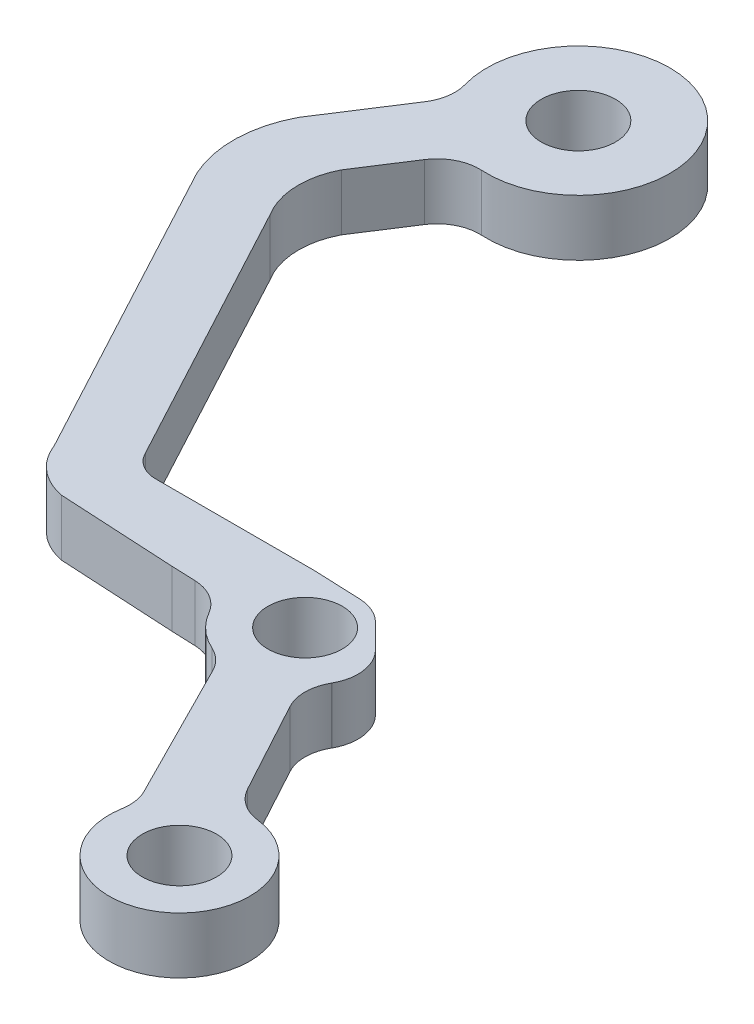
ISO-10303-21;
HEADER;
FILE_DESCRIPTION(('STEP AP214'),'2;1');
FILE_NAME('part.step','',(''),(''),'','','');
FILE_SCHEMA(('AUTOMOTIVE_DESIGN { 1 0 10303 214 1 1 1 1 }'));
ENDSEC;
DATA;
#1=APPLICATION_CONTEXT('core data for automotive mechanical design processes');
#2=APPLICATION_PROTOCOL_DEFINITION('international standard','automotive_design',2000,#1);
#3=PRODUCT_CONTEXT('',#1,'mechanical');
#4=PRODUCT('Part','Part','',(#3));
#5=PRODUCT_RELATED_PRODUCT_CATEGORY('part','',(#4));
#6=PRODUCT_DEFINITION_FORMATION('','',#4);
#7=PRODUCT_DEFINITION_CONTEXT('part definition',#1,'design');
#8=PRODUCT_DEFINITION('design','',#6,#7);
#9=PRODUCT_DEFINITION_SHAPE('','',#8);
#10=(LENGTH_UNIT() NAMED_UNIT(*) SI_UNIT(.MILLI.,.METRE.));
#11=(NAMED_UNIT(*) PLANE_ANGLE_UNIT() SI_UNIT($,.RADIAN.));
#12=(NAMED_UNIT(*) SI_UNIT($,.STERADIAN.) SOLID_ANGLE_UNIT());
#13=UNCERTAINTY_MEASURE_WITH_UNIT(LENGTH_MEASURE(1.E-05),#10,'distance_accuracy_value','');
#14=(GEOMETRIC_REPRESENTATION_CONTEXT(3) GLOBAL_UNCERTAINTY_ASSIGNED_CONTEXT((#13)) GLOBAL_UNIT_ASSIGNED_CONTEXT((#10,
#11,#12)) REPRESENTATION_CONTEXT('',''));
#15=CARTESIAN_POINT('',(0.,0.,0.));
#16=DIRECTION('',(0.,0.,1.));
#17=DIRECTION('',(1.,0.,0.));
#18=AXIS2_PLACEMENT_3D('',#15,#16,#17);
#19=CARTESIAN_POINT('',(83.0596199123193,0.,-55.4804717098662));
#20=DIRECTION('',(0.,1.,0.));
#21=DIRECTION('',(0.,0.,1.));
#22=AXIS2_PLACEMENT_3D('',#19,#20,#21);
#23=CYLINDRICAL_SURFACE('',#22,3.);
#24=CARTESIAN_POINT('',(83.0596199123193,4.,-55.4804717098662));
#25=DIRECTION('',(0.,-1.,0.));
#26=DIRECTION('',(0.,0.,-1.));
#27=AXIS2_PLACEMENT_3D('',#24,#25,#26);
#28=CIRCLE('',#27,3.);
#29=CARTESIAN_POINT('',(82.6980945632711,4.,-52.5023348053577));
#30=VERTEX_POINT('',#29);
#31=CARTESIAN_POINT('',(80.4223428568789,4.,-54.050517258547));
#32=VERTEX_POINT('',#31);
#33=EDGE_CURVE('E252',#30,#32,#28,.T.);
#34=ORIENTED_EDGE('',*,*,#33,.F.);
#35=DIRECTION('',(0.,1.,0.));
#36=VECTOR('',#35,1.);
#37=CARTESIAN_POINT('',(82.6980945632711,0.,-52.5023348053577));
#38=LINE('',#37,#36);
#39=CARTESIAN_POINT('',(82.6980945632711,0.,-52.5023348053577));
#40=VERTEX_POINT('',#39);
#41=EDGE_CURVE('E11',#40,#30,#38,.T.);
#42=ORIENTED_EDGE('',*,*,#41,.F.);
#43=CARTESIAN_POINT('',(83.0596199123193,0.,-55.4804717098662));
#44=DIRECTION('',(0.,-1.,0.));
#45=DIRECTION('',(0.,0.,-1.));
#46=AXIS2_PLACEMENT_3D('',#43,#44,#45);
#47=CIRCLE('',#46,3.);
#48=CARTESIAN_POINT('',(80.4223428568789,0.,-54.050517258547));
#49=VERTEX_POINT('',#48);
#50=EDGE_CURVE('E333',#40,#49,#47,.T.);
#51=ORIENTED_EDGE('',*,*,#50,.T.);
#52=DIRECTION('',(0.,1.,0.));
#53=VECTOR('',#52,1.);
#54=CARTESIAN_POINT('',(80.4223428568789,0.,-54.050517258547));
#55=LINE('',#54,#53);
#56=EDGE_CURVE('E38',#49,#32,#55,.T.);
#57=ORIENTED_EDGE('',*,*,#56,.T.);
#58=EDGE_LOOP('',(#34,#42,#51,#57));
#59=FACE_BOUND('',#58,.T.);
#60=ADVANCED_FACE('F35',(#59),#23,.F.);
#61=CARTESIAN_POINT('',(82.0955523148575,0.,-47.5387732978442));
#62=DIRECTION('',(0.,1.,0.));
#63=DIRECTION('',(0.,0.,1.));
#64=AXIS2_PLACEMENT_3D('',#61,#62,#63);
#65=CYLINDRICAL_SURFACE('',#64,4.99999999999926);
#66=CARTESIAN_POINT('',(82.0955523148575,4.,-47.5387732978442));
#67=DIRECTION('',(0.,1.,0.));
#68=DIRECTION('',(0.,0.,1.));
#69=AXIS2_PLACEMENT_3D('',#66,#67,#68);
#70=CIRCLE('',#69,4.99999999999926);
#71=CARTESIAN_POINT('',(77.1665825885927,4.,-48.3785693668741));
#72=VERTEX_POINT('',#71);
#73=EDGE_CURVE('E331',#72,#30,#70,.T.);
#74=ORIENTED_EDGE('',*,*,#73,.F.);
#75=DIRECTION('',(0.,1.,0.));
#76=VECTOR('',#75,1.);
#77=CARTESIAN_POINT('',(77.1665825885927,0.,-48.3785693668741));
#78=LINE('',#77,#76);
#79=CARTESIAN_POINT('',(77.1665825885927,0.,-48.3785693668741));
#80=VERTEX_POINT('',#79);
#81=EDGE_CURVE('E44',#80,#72,#78,.T.);
#82=ORIENTED_EDGE('',*,*,#81,.F.);
#83=CARTESIAN_POINT('',(82.0955523148575,0.,-47.5387732978442));
#84=DIRECTION('',(0.,1.,0.));
#85=DIRECTION('',(0.,0.,1.));
#86=AXIS2_PLACEMENT_3D('',#83,#84,#85);
#87=CIRCLE('',#86,4.99999999999926);
#88=EDGE_CURVE('E242',#80,#40,#87,.T.);
#89=ORIENTED_EDGE('',*,*,#88,.T.);
#90=ORIENTED_EDGE('',*,*,#41,.T.);
#91=EDGE_LOOP('',(#74,#82,#89,#90));
#92=FACE_BOUND('',#91,.T.);
#93=ADVANCED_FACE('F385',(#92),#65,.T.);
#94=CARTESIAN_POINT('',(74.2092007528334,0.,-48.8824470082921));
#95=DIRECTION('',(0.,1.,0.));
#96=DIRECTION('',(0.,0.,1.));
#97=AXIS2_PLACEMENT_3D('',#94,#95,#96);
#98=CYLINDRICAL_SURFACE('',#97,3.00000000000001);
#99=CARTESIAN_POINT('',(74.2092007528334,4.,-48.8824470082921));
#100=DIRECTION('',(0.,-1.,0.));
#101=DIRECTION('',(0.,0.,-1.));
#102=AXIS2_PLACEMENT_3D('',#99,#100,#101);
#103=CIRCLE('',#102,3.00000000000001);
#104=CARTESIAN_POINT('',(76.8865721846623,4.,-50.2358435562508));
#105=VERTEX_POINT('',#104);
#106=EDGE_CURVE('E229',#105,#72,#103,.T.);
#107=ORIENTED_EDGE('',*,*,#106,.F.);
#108=DIRECTION('',(0.,1.,0.));
#109=VECTOR('',#108,1.);
#110=CARTESIAN_POINT('',(76.8865721846623,0.,-50.2358435562508));
#111=LINE('',#110,#109);
#112=CARTESIAN_POINT('',(76.8865721846623,0.,-50.2358435562508));
#113=VERTEX_POINT('',#112);
#114=EDGE_CURVE('E224',#113,#105,#111,.T.);
#115=ORIENTED_EDGE('',*,*,#114,.F.);
#116=CARTESIAN_POINT('',(74.2092007528334,0.,-48.8824470082921));
#117=DIRECTION('',(0.,-1.,0.));
#118=DIRECTION('',(0.,0.,-1.));
#119=AXIS2_PLACEMENT_3D('',#116,#117,#118);
#120=CIRCLE('',#119,3.00000000000001);
#121=EDGE_CURVE('E227',#113,#80,#120,.T.);
#122=ORIENTED_EDGE('',*,*,#121,.T.);
#123=ORIENTED_EDGE('',*,*,#81,.T.);
#124=EDGE_LOOP('',(#107,#115,#122,#123));
#125=FACE_BOUND('',#124,.T.);
#126=ADVANCED_FACE('F226',(#125),#98,.F.);
#127=CARTESIAN_POINT('',(71.904734594805,0.,-60.0912179187853));
#128=DIRECTION('',(-0.892457143942962,0.,0.451132182652903));
#129=DIRECTION('',(0.451132182652903,0.,0.892457143942962));
#130=AXIS2_PLACEMENT_3D('',#127,#128,#129);
#131=PLANE('',#130);
#132=DIRECTION('',(0.451132182652903,0.,0.892457143942962));
#133=VECTOR('',#132,1.);
#134=CARTESIAN_POINT('',(71.904734594805,4.,-60.0912179187853));
#135=LINE('',#134,#133);
#136=CARTESIAN_POINT('',(71.904734594805,4.,-60.0912179187853));
#137=VERTEX_POINT('',#136);
#138=EDGE_CURVE('E328',#137,#105,#135,.T.);
#139=ORIENTED_EDGE('',*,*,#138,.F.);
#140=DIRECTION('',(0.,1.,0.));
#141=VECTOR('',#140,1.);
#142=CARTESIAN_POINT('',(71.904734594805,0.,-60.0912179187853));
#143=LINE('',#142,#141);
#144=CARTESIAN_POINT('',(71.904734594805,0.,-60.0912179187853));
#145=VERTEX_POINT('',#144);
#146=EDGE_CURVE('E234',#145,#137,#143,.T.);
#147=ORIENTED_EDGE('',*,*,#146,.F.);
#148=DIRECTION('',(0.451132182652903,0.,0.892457143942962));
#149=VECTOR('',#148,1.);
#150=CARTESIAN_POINT('',(71.904734594805,0.,-60.0912179187853));
#151=LINE('',#150,#149);
#152=EDGE_CURVE('E240',#145,#113,#151,.T.);
#153=ORIENTED_EDGE('',*,*,#152,.T.);
#154=ORIENTED_EDGE('',*,*,#114,.T.);
#155=EDGE_LOOP('',(#139,#147,#153,#154));
#156=FACE_BOUND('',#155,.T.);
#157=ADVANCED_FACE('F244',(#156),#131,.T.);
#158=CARTESIAN_POINT('',(69.2273631629761,0.,-58.7378213708266));
#159=DIRECTION('',(0.,1.,0.));
#160=DIRECTION('',(0.,0.,1.));
#161=AXIS2_PLACEMENT_3D('',#158,#159,#160);
#162=CYLINDRICAL_SURFACE('',#161,3.00000000000002);
#163=CARTESIAN_POINT('',(69.2273631629761,4.,-58.7378213708266));
#164=DIRECTION('',(0.,-1.,0.));
#165=DIRECTION('',(0.,0.,-1.));
#166=AXIS2_PLACEMENT_3D('',#163,#164,#165);
#167=CIRCLE('',#166,3.00000000000002);
#168=CARTESIAN_POINT('',(70.4690978001735,4.,-61.4687726869039));
#169=VERTEX_POINT('',#168);
#170=EDGE_CURVE('E325',#169,#137,#167,.T.);
#171=ORIENTED_EDGE('',*,*,#170,.F.);
#172=DIRECTION('',(0.,1.,0.));
#173=VECTOR('',#172,1.);
#174=CARTESIAN_POINT('',(70.4690978001735,0.,-61.4687726869039));
#175=LINE('',#174,#173);
#176=CARTESIAN_POINT('',(70.4690978001735,0.,-61.4687726869039));
#177=VERTEX_POINT('',#176);
#178=EDGE_CURVE('E337',#177,#169,#175,.T.);
#179=ORIENTED_EDGE('',*,*,#178,.F.);
#180=CARTESIAN_POINT('',(69.2273631629761,0.,-58.7378213708266));
#181=DIRECTION('',(0.,-1.,0.));
#182=DIRECTION('',(0.,0.,-1.));
#183=AXIS2_PLACEMENT_3D('',#180,#181,#182);
#184=CIRCLE('',#183,3.00000000000002);
#185=EDGE_CURVE('E245',#177,#145,#184,.T.);
#186=ORIENTED_EDGE('',*,*,#185,.T.);
#187=ORIENTED_EDGE('',*,*,#146,.T.);
#188=EDGE_LOOP('',(#171,#179,#186,#187));
#189=FACE_BOUND('',#188,.T.);
#190=ADVANCED_FACE('F398',(#189),#162,.F.);
#191=CARTESIAN_POINT('',(72.5386555288353,0.,-66.0203582136984));
#192=DIRECTION('',(0.,1.,0.));
#193=DIRECTION('',(0.,0.,1.));
#194=AXIS2_PLACEMENT_3D('',#191,#192,#193);
#195=CYLINDRICAL_SURFACE('',#194,4.99999999999894);
#196=CARTESIAN_POINT('',(72.5386555288353,4.,-66.0203582136984));
#197=DIRECTION('',(0.,1.,0.));
#198=DIRECTION('',(0.,0.,1.));
#199=AXIS2_PLACEMENT_3D('',#196,#197,#198);
#200=CIRCLE('',#199,4.99999999999894);
#201=CARTESIAN_POINT('',(68.2142097116327,4.,-63.5105438034147));
#202=VERTEX_POINT('',#201);
#203=EDGE_CURVE('E322',#202,#169,#200,.T.);
#204=ORIENTED_EDGE('',*,*,#203,.F.);
#205=DIRECTION('',(0.,1.,0.));
#206=VECTOR('',#205,1.);
#207=CARTESIAN_POINT('',(68.2142097116327,0.,-63.5105438034147));
#208=LINE('',#207,#206);
#209=CARTESIAN_POINT('',(68.2142097116327,0.,-63.5105438034147));
#210=VERTEX_POINT('',#209);
#211=EDGE_CURVE('E339',#210,#202,#208,.T.);
#212=ORIENTED_EDGE('',*,*,#211,.F.);
#213=CARTESIAN_POINT('',(72.5386555288353,0.,-66.0203582136984));
#214=DIRECTION('',(0.,1.,0.));
#215=DIRECTION('',(0.,0.,1.));
#216=AXIS2_PLACEMENT_3D('',#213,#214,#215);
#217=CIRCLE('',#216,4.99999999999894);
#218=EDGE_CURVE('E247',#210,#177,#217,.T.);
#219=ORIENTED_EDGE('',*,*,#218,.T.);
#220=ORIENTED_EDGE('',*,*,#178,.T.);
#221=EDGE_LOOP('',(#204,#212,#219,#220));
#222=FACE_BOUND('',#221,.T.);
#223=ADVANCED_FACE('F401',(#222),#195,.T.);
#224=CARTESIAN_POINT('',(65.6195422213106,0.,-62.0046551572441));
#225=DIRECTION('',(0.,1.,0.));
#226=DIRECTION('',(0.,0.,1.));
#227=AXIS2_PLACEMENT_3D('',#224,#225,#226);
#228=CYLINDRICAL_SURFACE('',#227,3.);
#229=CARTESIAN_POINT('',(65.6195422213106,4.,-62.0046551572441));
#230=DIRECTION('',(0.,-1.,0.));
#231=DIRECTION('',(0.,0.,-1.));
#232=AXIS2_PLACEMENT_3D('',#229,#230,#231);
#233=CIRCLE('',#232,3.);
#234=CARTESIAN_POINT('',(65.7370015210181,4.,-65.0023548274766));
#235=VERTEX_POINT('',#234);
#236=EDGE_CURVE('E319',#235,#202,#233,.T.);
#237=ORIENTED_EDGE('',*,*,#236,.F.);
#238=DIRECTION('',(0.,1.,0.));
#239=VECTOR('',#238,1.);
#240=CARTESIAN_POINT('',(65.7370015210181,0.,-65.0023548274766));
#241=LINE('',#240,#239);
#242=CARTESIAN_POINT('',(65.7370015210181,0.,-65.0023548274766));
#243=VERTEX_POINT('',#242);
#244=EDGE_CURVE('E341',#243,#235,#241,.T.);
#245=ORIENTED_EDGE('',*,*,#244,.F.);
#246=CARTESIAN_POINT('',(65.6195422213106,0.,-62.0046551572441));
#247=DIRECTION('',(0.,-1.,0.));
#248=DIRECTION('',(0.,0.,-1.));
#249=AXIS2_PLACEMENT_3D('',#246,#247,#248);
#250=CIRCLE('',#249,3.);
#251=EDGE_CURVE('E597',#243,#210,#250,.T.);
#252=ORIENTED_EDGE('',*,*,#251,.T.);
#253=ORIENTED_EDGE('',*,*,#211,.T.);
#254=EDGE_LOOP('',(#237,#245,#252,#253));
#255=FACE_BOUND('',#254,.T.);
#256=ADVANCED_FACE('F405',(#255),#228,.F.);
#257=CARTESIAN_POINT('',(64.0438520876017,0.,-65.0686977465904));
#258=DIRECTION('',(-0.0391530999025642,0.,0.999233223410841));
#259=DIRECTION('',(0.999233223410841,0.,0.0391530999025642));
#260=AXIS2_PLACEMENT_3D('',#257,#258,#259);
#261=PLANE('',#260);
#262=DIRECTION('',(0.999233223410841,0.,0.0391530999025642));
#263=VECTOR('',#262,1.);
#264=CARTESIAN_POINT('',(64.0438520876017,4.,-65.0686977465904));
#265=LINE('',#264,#263);
#266=CARTESIAN_POINT('',(64.0438520876017,4.,-65.0686977465904));
#267=VERTEX_POINT('',#266);
#268=EDGE_CURVE('E316',#267,#235,#265,.T.);
#269=ORIENTED_EDGE('',*,*,#268,.F.);
#270=DIRECTION('',(0.,1.,0.));
#271=VECTOR('',#270,1.);
#272=CARTESIAN_POINT('',(64.0438520876017,0.,-65.0686977465904));
#273=LINE('',#272,#271);
#274=CARTESIAN_POINT('',(64.0438520876017,0.,-65.0686977465904));
#275=VERTEX_POINT('',#274);
#276=EDGE_CURVE('E343',#275,#267,#273,.T.);
#277=ORIENTED_EDGE('',*,*,#276,.F.);
#278=DIRECTION('',(0.999233223410841,0.,0.0391530999025642));
#279=VECTOR('',#278,1.);
#280=CARTESIAN_POINT('',(64.0438520876017,0.,-65.0686977465904));
#281=LINE('',#280,#279);
#282=EDGE_CURVE('E594',#275,#243,#281,.T.);
#283=ORIENTED_EDGE('',*,*,#282,.T.);
#284=ORIENTED_EDGE('',*,*,#244,.T.);
#285=EDGE_LOOP('',(#269,#277,#283,#284));
#286=FACE_BOUND('',#285,.T.);
#287=ADVANCED_FACE('F409',(#286),#261,.T.);
#288=CARTESIAN_POINT('',(55.7375550039908,0.,-65.5195460971233));
#289=DIRECTION('',(-0.054198120998577,0.,0.998530201686571));
#290=DIRECTION('',(0.998530201686571,0.,0.054198120998577));
#291=AXIS2_PLACEMENT_3D('',#288,#289,#290);
#292=PLANE('',#291);
#293=DIRECTION('',(0.998530201686571,0.,0.054198120998577));
#294=VECTOR('',#293,1.);
#295=CARTESIAN_POINT('',(55.7375550039908,4.,-65.5195460971233));
#296=LINE('',#295,#294);
#297=CARTESIAN_POINT('',(55.7375550039908,4.,-65.5195460971233));
#298=VERTEX_POINT('',#297);
#299=EDGE_CURVE('E313',#298,#267,#296,.T.);
#300=ORIENTED_EDGE('',*,*,#299,.F.);
#301=DIRECTION('',(0.,1.,0.));
#302=VECTOR('',#301,1.);
#303=CARTESIAN_POINT('',(55.7375550039908,0.,-65.5195460971233));
#304=LINE('',#303,#302);
#305=CARTESIAN_POINT('',(55.7375550039908,0.,-65.5195460971233));
#306=VERTEX_POINT('',#305);
#307=EDGE_CURVE('E345',#306,#298,#304,.T.);
#308=ORIENTED_EDGE('',*,*,#307,.F.);
#309=DIRECTION('',(0.998530201686571,0.,0.054198120998577));
#310=VECTOR('',#309,1.);
#311=CARTESIAN_POINT('',(55.7375550039908,0.,-65.5195460971233));
#312=LINE('',#311,#310);
#313=EDGE_CURVE('E591',#306,#275,#312,.T.);
#314=ORIENTED_EDGE('',*,*,#313,.T.);
#315=ORIENTED_EDGE('',*,*,#276,.T.);
#316=EDGE_LOOP('',(#300,#308,#314,#315));
#317=FACE_BOUND('',#316,.T.);
#318=ADVANCED_FACE('F413',(#317),#292,.T.);
#319=CARTESIAN_POINT('',(56.5567534131058,0.,-69.8369992339137));
#320=DIRECTION('',(0.,1.,0.));
#321=DIRECTION('',(0.,0.,1.));
#322=AXIS2_PLACEMENT_3D('',#319,#320,#321);
#323=CYLINDRICAL_SURFACE('',#322,4.39448377194385);
#324=CARTESIAN_POINT('',(56.5567534131058,4.,-69.8369992339137));
#325=DIRECTION('',(0.,1.,0.));
#326=DIRECTION('',(0.,0.,1.));
#327=AXIS2_PLACEMENT_3D('',#324,#325,#326);
#328=CIRCLE('',#327,4.39448377194385);
#329=CARTESIAN_POINT('',(52.4487514228716,4.,-68.2762919358881));
#330=VERTEX_POINT('',#329);
#331=EDGE_CURVE('E310',#330,#298,#328,.T.);
#332=ORIENTED_EDGE('',*,*,#331,.F.);
#333=DIRECTION('',(0.,1.,0.));
#334=VECTOR('',#333,1.);
#335=CARTESIAN_POINT('',(52.4487514228716,0.,-68.2762919358881));
#336=LINE('',#335,#334);
#337=CARTESIAN_POINT('',(52.4487514228716,0.,-68.2762919358881));
#338=VERTEX_POINT('',#337);
#339=EDGE_CURVE('E347',#338,#330,#336,.T.);
#340=ORIENTED_EDGE('',*,*,#339,.F.);
#341=CARTESIAN_POINT('',(56.5567534131058,0.,-69.8369992339137));
#342=DIRECTION('',(0.,1.,0.));
#343=DIRECTION('',(0.,0.,1.));
#344=AXIS2_PLACEMENT_3D('',#341,#342,#343);
#345=CIRCLE('',#344,4.39448377194385);
#346=EDGE_CURVE('E588',#338,#306,#345,.T.);
#347=ORIENTED_EDGE('',*,*,#346,.T.);
#348=ORIENTED_EDGE('',*,*,#307,.T.);
#349=EDGE_LOOP('',(#332,#340,#347,#348));
#350=FACE_BOUND('',#349,.T.);
#351=ADVANCED_FACE('F417',(#350),#323,.T.);
#352=CARTESIAN_POINT('',(40.729811239487,0.,-90.1399863078729));
#353=DIRECTION('',(-0.881375126691502,0.,0.472417067906675));
#354=DIRECTION('',(0.472417067906675,0.,0.881375126691502));
#355=AXIS2_PLACEMENT_3D('',#352,#353,#354);
#356=PLANE('',#355);
#357=DIRECTION('',(0.472417067906675,0.,0.881375126691502));
#358=VECTOR('',#357,1.);
#359=CARTESIAN_POINT('',(40.729811239487,4.,-90.1399863078729));
#360=LINE('',#359,#358);
#361=CARTESIAN_POINT('',(40.729811239487,4.,-90.1399863078729));
#362=VERTEX_POINT('',#361);
#363=EDGE_CURVE('E307',#362,#330,#360,.T.);
#364=ORIENTED_EDGE('',*,*,#363,.F.);
#365=DIRECTION('',(0.,1.,0.));
#366=VECTOR('',#365,1.);
#367=CARTESIAN_POINT('',(40.729811239487,0.,-90.1399863078729));
#368=LINE('',#367,#366);
#369=CARTESIAN_POINT('',(40.729811239487,0.,-90.1399863078729));
#370=VERTEX_POINT('',#369);
#371=EDGE_CURVE('E349',#370,#362,#368,.T.);
#372=ORIENTED_EDGE('',*,*,#371,.F.);
#373=DIRECTION('',(0.472417067906675,0.,0.881375126691502));
#374=VECTOR('',#373,1.);
#375=CARTESIAN_POINT('',(40.729811239487,0.,-90.1399863078729));
#376=LINE('',#375,#374);
#377=EDGE_CURVE('E585',#370,#338,#376,.T.);
#378=ORIENTED_EDGE('',*,*,#377,.T.);
#379=ORIENTED_EDGE('',*,*,#339,.T.);
#380=EDGE_LOOP('',(#364,#372,#378,#379));
#381=FACE_BOUND('',#380,.T.);
#382=ADVANCED_FACE('F421',(#381),#356,.T.);
#383=CARTESIAN_POINT('',(47.9507836864078,0.,-93.4720928434898));
#384=DIRECTION('',(0.,1.,0.));
#385=DIRECTION('',(0.,0.,1.));
#386=AXIS2_PLACEMENT_3D('',#383,#384,#385);
#387=CYLINDRICAL_SURFACE('',#386,7.95269621222196);
#388=CARTESIAN_POINT('',(47.9507836864078,4.,-93.4720928434898));
#389=DIRECTION('',(0.,1.,0.));
#390=DIRECTION('',(0.,0.,1.));
#391=AXIS2_PLACEMENT_3D('',#388,#389,#390);
#392=CIRCLE('',#391,7.95269621222196);
#393=CARTESIAN_POINT('',(40.9176822364304,4.,-97.1843510562513));
#394=VERTEX_POINT('',#393);
#395=EDGE_CURVE('E304',#394,#362,#392,.T.);
#396=ORIENTED_EDGE('',*,*,#395,.F.);
#397=DIRECTION('',(0.,1.,0.));
#398=VECTOR('',#397,1.);
#399=CARTESIAN_POINT('',(40.9176822364304,0.,-97.1843510562513));
#400=LINE('',#399,#398);
#401=CARTESIAN_POINT('',(40.9176822364304,0.,-97.1843510562513));
#402=VERTEX_POINT('',#401);
#403=EDGE_CURVE('E351',#402,#394,#400,.T.);
#404=ORIENTED_EDGE('',*,*,#403,.F.);
#405=CARTESIAN_POINT('',(47.9507836864078,0.,-93.4720928434898));
#406=DIRECTION('',(0.,1.,0.));
#407=DIRECTION('',(0.,0.,1.));
#408=AXIS2_PLACEMENT_3D('',#405,#406,#407);
#409=CIRCLE('',#408,7.95269621222196);
#410=EDGE_CURVE('E582',#402,#370,#409,.T.);
#411=ORIENTED_EDGE('',*,*,#410,.T.);
#412=ORIENTED_EDGE('',*,*,#371,.T.);
#413=EDGE_LOOP('',(#396,#404,#411,#412));
#414=FACE_BOUND('',#413,.T.);
#415=ADVANCED_FACE('F425',(#414),#387,.T.);
#416=CARTESIAN_POINT('',(44.4477571247904,0.,-102.646677462451));
#417=DIRECTION('',(-0.839876598626589,0.,-0.542777393670215));
#418=DIRECTION('',(-0.542777393670215,0.,0.839876598626589));
#419=AXIS2_PLACEMENT_3D('',#416,#417,#418);
#420=PLANE('',#419);
#421=DIRECTION('',(-0.542777393670215,0.,0.839876598626589));
#422=VECTOR('',#421,1.);
#423=CARTESIAN_POINT('',(44.4477571247904,4.,-102.646677462451));
#424=LINE('',#423,#422);
#425=CARTESIAN_POINT('',(44.4477571247904,4.,-102.646677462451));
#426=VERTEX_POINT('',#425);
#427=EDGE_CURVE('E301',#426,#394,#424,.T.);
#428=ORIENTED_EDGE('',*,*,#427,.F.);
#429=DIRECTION('',(0.,1.,0.));
#430=VECTOR('',#429,1.);
#431=CARTESIAN_POINT('',(44.4477571247904,0.,-102.646677462451));
#432=LINE('',#431,#430);
#433=CARTESIAN_POINT('',(44.4477571247904,0.,-102.646677462451));
#434=VERTEX_POINT('',#433);
#435=EDGE_CURVE('E353',#434,#426,#432,.T.);
#436=ORIENTED_EDGE('',*,*,#435,.F.);
#437=DIRECTION('',(-0.542777393670215,0.,0.839876598626589));
#438=VECTOR('',#437,1.);
#439=CARTESIAN_POINT('',(44.4477571247904,0.,-102.646677462451));
#440=LINE('',#439,#438);
#441=EDGE_CURVE('E579',#434,#402,#440,.T.);
#442=ORIENTED_EDGE('',*,*,#441,.T.);
#443=ORIENTED_EDGE('',*,*,#403,.T.);
#444=EDGE_LOOP('',(#428,#436,#442,#443));
#445=FACE_BOUND('',#444,.T.);
#446=ADVANCED_FACE('F429',(#445),#420,.T.);
#447=CARTESIAN_POINT('',(41.9281273289106,0.,-104.275009643461));
#448=DIRECTION('',(0.,1.,0.));
#449=DIRECTION('',(0.,0.,1.));
#450=AXIS2_PLACEMENT_3D('',#447,#448,#449);
#451=CYLINDRICAL_SURFACE('',#450,3.);
#452=CARTESIAN_POINT('',(41.9281273289106,4.,-104.275009643461));
#453=DIRECTION('',(0.,-1.,0.));
#454=DIRECTION('',(0.,0.,-1.));
#455=AXIS2_PLACEMENT_3D('',#452,#453,#454);
#456=CIRCLE('',#455,3.);
#457=CARTESIAN_POINT('',(44.8098479908705,4.,-105.109087593316));
#458=VERTEX_POINT('',#457);
#459=EDGE_CURVE('E298',#458,#426,#456,.T.);
#460=ORIENTED_EDGE('',*,*,#459,.F.);
#461=DIRECTION('',(0.,1.,0.));
#462=VECTOR('',#461,1.);
#463=CARTESIAN_POINT('',(44.8098479908705,0.,-105.109087593316));
#464=LINE('',#463,#462);
#465=CARTESIAN_POINT('',(44.8098479908705,0.,-105.109087593316));
#466=VERTEX_POINT('',#465);
#467=EDGE_CURVE('E355',#466,#458,#464,.T.);
#468=ORIENTED_EDGE('',*,*,#467,.F.);
#469=CARTESIAN_POINT('',(41.9281273289106,0.,-104.275009643461));
#470=DIRECTION('',(0.,-1.,0.));
#471=DIRECTION('',(0.,0.,-1.));
#472=AXIS2_PLACEMENT_3D('',#469,#470,#471);
#473=CIRCLE('',#472,3.);
#474=EDGE_CURVE('E576',#466,#434,#473,.T.);
#475=ORIENTED_EDGE('',*,*,#474,.T.);
#476=ORIENTED_EDGE('',*,*,#435,.T.);
#477=EDGE_LOOP('',(#460,#468,#475,#476));
#478=FACE_BOUND('',#477,.T.);
#479=ADVANCED_FACE('F433',(#478),#451,.F.);
#480=CARTESIAN_POINT('',(51.0535760917837,0.,-106.916256484667));
#481=DIRECTION('',(0.,1.,0.));
#482=DIRECTION('',(0.,0.,1.));
#483=AXIS2_PLACEMENT_3D('',#480,#481,#482);
#484=CYLINDRICAL_SURFACE('',#483,6.50000000000002);
#485=CARTESIAN_POINT('',(51.0535760917837,4.,-106.916256484667));
#486=DIRECTION('',(0.,1.,0.));
#487=DIRECTION('',(0.,0.,1.));
#488=AXIS2_PLACEMENT_3D('',#485,#486,#487);
#489=CIRCLE('',#488,6.50000000000002);
#490=CARTESIAN_POINT('',(50.6775616564036,4.,-100.427141510775));
#491=VERTEX_POINT('',#490);
#492=EDGE_CURVE('E295',#491,#458,#489,.T.);
#493=ORIENTED_EDGE('',*,*,#492,.F.);
#494=DIRECTION('',(0.,1.,0.));
#495=VECTOR('',#494,1.);
#496=CARTESIAN_POINT('',(50.6775616564036,0.,-100.427141510775));
#497=LINE('',#496,#495);
#498=CARTESIAN_POINT('',(50.6775616564036,0.,-100.427141510775));
#499=VERTEX_POINT('',#498);
#500=EDGE_CURVE('E357',#499,#491,#497,.T.);
#501=ORIENTED_EDGE('',*,*,#500,.F.);
#502=CARTESIAN_POINT('',(51.0535760917837,0.,-106.916256484667));
#503=DIRECTION('',(0.,1.,0.));
#504=DIRECTION('',(0.,0.,1.));
#505=AXIS2_PLACEMENT_3D('',#502,#503,#504);
#506=CIRCLE('',#505,6.50000000000002);
#507=EDGE_CURVE('E573',#499,#466,#506,.T.);
#508=ORIENTED_EDGE('',*,*,#507,.T.);
#509=ORIENTED_EDGE('',*,*,#467,.T.);
#510=EDGE_LOOP('',(#493,#501,#508,#509));
#511=FACE_BOUND('',#510,.T.);
#512=ADVANCED_FACE('F437',(#511),#484,.T.);
#513=CARTESIAN_POINT('',(50.504016532382,0.,-97.4321653689791));
#514=DIRECTION('',(0.,1.,0.));
#515=DIRECTION('',(0.,0.,1.));
#516=AXIS2_PLACEMENT_3D('',#513,#514,#515);
#517=CYLINDRICAL_SURFACE('',#516,3.);
#518=CARTESIAN_POINT('',(50.504016532382,4.,-97.4321653689791));
#519=DIRECTION('',(0.,-1.,0.));
#520=DIRECTION('',(0.,0.,-1.));
#521=AXIS2_PLACEMENT_3D('',#518,#519,#520);
#522=CIRCLE('',#521,3.);
#523=CARTESIAN_POINT('',(47.9843867365023,4.,-99.0604975499897));
#524=VERTEX_POINT('',#523);
#525=EDGE_CURVE('E292',#524,#491,#522,.T.);
#526=ORIENTED_EDGE('',*,*,#525,.F.);
#527=DIRECTION('',(0.,1.,0.));
#528=VECTOR('',#527,1.);
#529=CARTESIAN_POINT('',(47.9843867365023,0.,-99.0604975499897));
#530=LINE('',#529,#528);
#531=CARTESIAN_POINT('',(47.9843867365023,0.,-99.0604975499897));
#532=VERTEX_POINT('',#531);
#533=EDGE_CURVE('E359',#532,#524,#530,.T.);
#534=ORIENTED_EDGE('',*,*,#533,.F.);
#535=CARTESIAN_POINT('',(50.504016532382,0.,-97.4321653689791));
#536=DIRECTION('',(0.,-1.,0.));
#537=DIRECTION('',(0.,0.,-1.));
#538=AXIS2_PLACEMENT_3D('',#535,#536,#537);
#539=CIRCLE('',#538,3.);
#540=EDGE_CURVE('E570',#532,#499,#539,.T.);
#541=ORIENTED_EDGE('',*,*,#540,.T.);
#542=ORIENTED_EDGE('',*,*,#500,.T.);
#543=EDGE_LOOP('',(#526,#534,#541,#542));
#544=FACE_BOUND('',#543,.T.);
#545=ADVANCED_FACE('F441',(#544),#517,.F.);
#546=CARTESIAN_POINT('',(45.6619983025613,0.,-95.4669070258914));
#547=DIRECTION('',(0.839876598626591,0.,0.542777393670212));
#548=DIRECTION('',(0.542777393670212,0.,-0.839876598626591));
#549=AXIS2_PLACEMENT_3D('',#546,#547,#548);
#550=PLANE('',#549);
#551=DIRECTION('',(0.542777393670212,0.,-0.839876598626591));
#552=VECTOR('',#551,1.);
#553=CARTESIAN_POINT('',(45.6619983025613,4.,-95.4669070258914));
#554=LINE('',#553,#552);
#555=CARTESIAN_POINT('',(45.6619983025613,4.,-95.4669070258914));
#556=VERTEX_POINT('',#555);
#557=EDGE_CURVE('E289',#556,#524,#554,.T.);
#558=ORIENTED_EDGE('',*,*,#557,.F.);
#559=DIRECTION('',(0.,1.,0.));
#560=VECTOR('',#559,1.);
#561=CARTESIAN_POINT('',(45.6619983025613,0.,-95.4669070258914));
#562=LINE('',#561,#560);
#563=CARTESIAN_POINT('',(45.6619983025613,0.,-95.4669070258914));
#564=VERTEX_POINT('',#563);
#565=EDGE_CURVE('E361',#564,#556,#562,.T.);
#566=ORIENTED_EDGE('',*,*,#565,.F.);
#567=DIRECTION('',(0.542777393670212,0.,-0.839876598626591));
#568=VECTOR('',#567,1.);
#569=CARTESIAN_POINT('',(45.6619983025613,0.,-95.4669070258914));
#570=LINE('',#569,#568);
#571=EDGE_CURVE('E567',#564,#532,#570,.T.);
#572=ORIENTED_EDGE('',*,*,#571,.T.);
#573=ORIENTED_EDGE('',*,*,#533,.T.);
#574=EDGE_LOOP('',(#558,#566,#572,#573));
#575=FACE_BOUND('',#574,.T.);
#576=ADVANCED_FACE('F445',(#575),#550,.T.);
#577=CARTESIAN_POINT('',(50.4346230187118,0.,-93.0228199018659));
#578=DIRECTION('',(0.,1.,0.));
#579=DIRECTION('',(0.,0.,1.));
#580=AXIS2_PLACEMENT_3D('',#577,#578,#579);
#581=CYLINDRICAL_SURFACE('',#580,5.36204331864607);
#582=CARTESIAN_POINT('',(50.4346230187118,4.,-93.0228199018659));
#583=DIRECTION('',(0.,-1.,0.));
#584=DIRECTION('',(0.,0.,-1.));
#585=AXIS2_PLACEMENT_3D('',#582,#583,#584);
#586=CIRCLE('',#585,5.36204331864607);
#587=CARTESIAN_POINT('',(45.9134750427678,4.,-90.1399863078728));
#588=VERTEX_POINT('',#587);
#589=EDGE_CURVE('E286',#588,#556,#586,.T.);
#590=ORIENTED_EDGE('',*,*,#589,.F.);
#591=DIRECTION('',(0.,1.,0.));
#592=VECTOR('',#591,1.);
#593=CARTESIAN_POINT('',(45.9134750427678,0.,-90.1399863078728));
#594=LINE('',#593,#592);
#595=CARTESIAN_POINT('',(45.9134750427678,0.,-90.1399863078728));
#596=VERTEX_POINT('',#595);
#597=EDGE_CURVE('E363',#596,#588,#594,.T.);
#598=ORIENTED_EDGE('',*,*,#597,.F.);
#599=CARTESIAN_POINT('',(50.4346230187118,0.,-93.0228199018659));
#600=DIRECTION('',(0.,-1.,0.));
#601=DIRECTION('',(0.,0.,-1.));
#602=AXIS2_PLACEMENT_3D('',#599,#600,#601);
#603=CIRCLE('',#602,5.36204331864607);
#604=EDGE_CURVE('E564',#596,#564,#603,.T.);
#605=ORIENTED_EDGE('',*,*,#604,.T.);
#606=ORIENTED_EDGE('',*,*,#565,.T.);
#607=EDGE_LOOP('',(#590,#598,#605,#606));
#608=FACE_BOUND('',#607,.T.);
#609=ADVANCED_FACE('F449',(#608),#581,.F.);
#610=CARTESIAN_POINT('',(56.1159876547183,0.,-71.1054478527404));
#611=DIRECTION('',(0.881375126691525,0.,-0.472417067906631));
#612=DIRECTION('',(-0.472417067906631,0.,-0.881375126691525));
#613=AXIS2_PLACEMENT_3D('',#610,#611,#612);
#614=PLANE('',#613);
#615=DIRECTION('',(-0.472417067906631,0.,-0.881375126691525));
#616=VECTOR('',#615,1.);
#617=CARTESIAN_POINT('',(56.1159876547183,4.,-71.1054478527404));
#618=LINE('',#617,#616);
#619=CARTESIAN_POINT('',(56.1159876547183,4.,-71.1054478527404));
#620=VERTEX_POINT('',#619);
#621=EDGE_CURVE('E283',#620,#588,#618,.T.);
#622=ORIENTED_EDGE('',*,*,#621,.F.);
#623=DIRECTION('',(0.,1.,0.));
#624=VECTOR('',#623,1.);
#625=CARTESIAN_POINT('',(56.1159876547183,0.,-71.1054478527404));
#626=LINE('',#625,#624);
#627=CARTESIAN_POINT('',(56.1159876547183,0.,-71.1054478527404));
#628=VERTEX_POINT('',#627);
#629=EDGE_CURVE('E365',#628,#620,#626,.T.);
#630=ORIENTED_EDGE('',*,*,#629,.F.);
#631=DIRECTION('',(-0.472417067906631,0.,-0.881375126691525));
#632=VECTOR('',#631,1.);
#633=CARTESIAN_POINT('',(56.1159876547183,0.,-71.1054478527404));
#634=LINE('',#633,#632);
#635=EDGE_CURVE('E561',#628,#596,#634,.T.);
#636=ORIENTED_EDGE('',*,*,#635,.T.);
#637=ORIENTED_EDGE('',*,*,#597,.T.);
#638=EDGE_LOOP('',(#622,#630,#636,#637));
#639=FACE_BOUND('',#638,.T.);
#640=ADVANCED_FACE('F453',(#639),#614,.T.);
#641=CARTESIAN_POINT('',(58.0835273072173,0.,-72.0445419678826));
#642=DIRECTION('',(0.,1.,0.));
#643=DIRECTION('',(0.,0.,1.));
#644=AXIS2_PLACEMENT_3D('',#641,#642,#643);
#645=CYLINDRICAL_SURFACE('',#644,2.18016284741548);
#646=CARTESIAN_POINT('',(58.0835273072173,4.,-72.0445419678826));
#647=DIRECTION('',(0.,-1.,0.));
#648=DIRECTION('',(0.,0.,-1.));
#649=AXIS2_PLACEMENT_3D('',#646,#647,#648);
#650=CIRCLE('',#649,2.18016284741548);
#651=CARTESIAN_POINT('',(58.0479318695405,4.,-69.864669722528));
#652=VERTEX_POINT('',#651);
#653=EDGE_CURVE('E280',#652,#620,#650,.T.);
#654=ORIENTED_EDGE('',*,*,#653,.F.);
#655=DIRECTION('',(0.,1.,0.));
#656=VECTOR('',#655,1.);
#657=CARTESIAN_POINT('',(58.0479318695405,0.,-69.864669722528));
#658=LINE('',#657,#656);
#659=CARTESIAN_POINT('',(58.0479318695405,0.,-69.864669722528));
#660=VERTEX_POINT('',#659);
#661=EDGE_CURVE('E367',#660,#652,#658,.T.);
#662=ORIENTED_EDGE('',*,*,#661,.F.);
#663=CARTESIAN_POINT('',(58.0835273072173,0.,-72.0445419678826));
#664=DIRECTION('',(0.,-1.,0.));
#665=DIRECTION('',(0.,0.,-1.));
#666=AXIS2_PLACEMENT_3D('',#663,#664,#665);
#667=CIRCLE('',#666,2.18016284741548);
#668=EDGE_CURVE('E558',#660,#628,#667,.T.);
#669=ORIENTED_EDGE('',*,*,#668,.T.);
#670=ORIENTED_EDGE('',*,*,#629,.T.);
#671=EDGE_LOOP('',(#654,#662,#669,#670));
#672=FACE_BOUND('',#671,.T.);
#673=ADVANCED_FACE('F457',(#672),#645,.F.);
#674=CARTESIAN_POINT('',(69.3415835835907,0.,-69.8646697225282));
#675=DIRECTION('',(0.,0.,-1.));
#676=DIRECTION('',(-1.,0.,0.));
#677=AXIS2_PLACEMENT_3D('',#674,#675,#676);
#678=PLANE('',#677);
#679=DIRECTION('',(-1.,0.,0.));
#680=VECTOR('',#679,1.);
#681=CARTESIAN_POINT('',(69.3415835835907,4.,-69.8646697225282));
#682=LINE('',#681,#680);
#683=CARTESIAN_POINT('',(69.3415835835907,4.,-69.8646697225282));
#684=VERTEX_POINT('',#683);
#685=EDGE_CURVE('E277',#684,#652,#682,.T.);
#686=ORIENTED_EDGE('',*,*,#685,.F.);
#687=DIRECTION('',(0.,1.,0.));
#688=VECTOR('',#687,1.);
#689=CARTESIAN_POINT('',(69.3415835835907,0.,-69.8646697225282));
#690=LINE('',#689,#688);
#691=CARTESIAN_POINT('',(69.3415835835907,0.,-69.8646697225282));
#692=VERTEX_POINT('',#691);
#693=EDGE_CURVE('E369',#692,#684,#690,.T.);
#694=ORIENTED_EDGE('',*,*,#693,.F.);
#695=DIRECTION('',(-1.,0.,0.));
#696=VECTOR('',#695,1.);
#697=CARTESIAN_POINT('',(69.3415835835907,0.,-69.8646697225282));
#698=LINE('',#697,#696);
#699=EDGE_CURVE('E555',#692,#660,#698,.T.);
#700=ORIENTED_EDGE('',*,*,#699,.T.);
#701=ORIENTED_EDGE('',*,*,#661,.T.);
#702=EDGE_LOOP('',(#686,#694,#700,#701));
#703=FACE_BOUND('',#702,.T.);
#704=ADVANCED_FACE('F461',(#703),#678,.T.);
#705=CARTESIAN_POINT('',(72.7129499535184,0.,-69.725016274071));
#706=DIRECTION('',(0.0413879037739194,0.,-0.999143153617739));
#707=DIRECTION('',(-0.999143153617739,0.,-0.0413879037739194));
#708=AXIS2_PLACEMENT_3D('',#705,#706,#707);
#709=PLANE('',#708);
#710=DIRECTION('',(-0.999143153617739,0.,-0.0413879037739194));
#711=VECTOR('',#710,1.);
#712=CARTESIAN_POINT('',(72.7129499535184,4.,-69.725016274071));
#713=LINE('',#712,#711);
#714=CARTESIAN_POINT('',(72.7129499535184,4.,-69.725016274071));
#715=VERTEX_POINT('',#714);
#716=EDGE_CURVE('E274',#715,#684,#713,.T.);
#717=ORIENTED_EDGE('',*,*,#716,.F.);
#718=DIRECTION('',(0.,1.,0.));
#719=VECTOR('',#718,1.);
#720=CARTESIAN_POINT('',(72.7129499535184,0.,-69.725016274071));
#721=LINE('',#720,#719);
#722=CARTESIAN_POINT('',(72.7129499535184,0.,-69.725016274071));
#723=VERTEX_POINT('',#722);
#724=EDGE_CURVE('E371',#723,#715,#721,.T.);
#725=ORIENTED_EDGE('',*,*,#724,.F.);
#726=DIRECTION('',(-0.999143153617739,0.,-0.0413879037739194));
#727=VECTOR('',#726,1.);
#728=CARTESIAN_POINT('',(72.7129499535184,0.,-69.725016274071));
#729=LINE('',#728,#727);
#730=EDGE_CURVE('E552',#723,#692,#729,.T.);
#731=ORIENTED_EDGE('',*,*,#730,.T.);
#732=ORIENTED_EDGE('',*,*,#693,.T.);
#733=EDGE_LOOP('',(#717,#725,#731,#732));
#734=FACE_BOUND('',#733,.T.);
#735=ADVANCED_FACE('F465',(#734),#709,.T.);
#736=CARTESIAN_POINT('',(72.5887862421966,0.,-66.7275868132178));
#737=DIRECTION('',(0.,1.,0.));
#738=DIRECTION('',(0.,0.,1.));
#739=AXIS2_PLACEMENT_3D('',#736,#737,#738);
#740=CYLINDRICAL_SURFACE('',#739,2.99999999999999);
#741=CARTESIAN_POINT('',(72.5887862421966,4.,-66.7275868132178));
#742=DIRECTION('',(0.,1.,0.));
#743=DIRECTION('',(0.,0.,1.));
#744=AXIS2_PLACEMENT_3D('',#741,#742,#743);
#745=CIRCLE('',#744,2.99999999999999);
#746=CARTESIAN_POINT('',(74.7101065857564,4.,-68.8489071567772));
#747=VERTEX_POINT('',#746);
#748=EDGE_CURVE('E271',#747,#715,#745,.T.);
#749=ORIENTED_EDGE('',*,*,#748,.F.);
#750=DIRECTION('',(0.,1.,0.));
#751=VECTOR('',#750,1.);
#752=CARTESIAN_POINT('',(74.7101065857564,0.,-68.8489071567772));
#753=LINE('',#752,#751);
#754=CARTESIAN_POINT('',(74.7101065857564,0.,-68.8489071567772));
#755=VERTEX_POINT('',#754);
#756=EDGE_CURVE('E373',#755,#747,#753,.T.);
#757=ORIENTED_EDGE('',*,*,#756,.F.);
#758=CARTESIAN_POINT('',(72.5887862421966,0.,-66.7275868132178));
#759=DIRECTION('',(0.,1.,0.));
#760=DIRECTION('',(0.,0.,1.));
#761=AXIS2_PLACEMENT_3D('',#758,#759,#760);
#762=CIRCLE('',#761,2.99999999999999);
#763=EDGE_CURVE('E549',#755,#723,#762,.T.);
#764=ORIENTED_EDGE('',*,*,#763,.T.);
#765=ORIENTED_EDGE('',*,*,#724,.T.);
#766=EDGE_LOOP('',(#749,#757,#764,#765));
#767=FACE_BOUND('',#766,.T.);
#768=ADVANCED_FACE('F469',(#767),#740,.T.);
#769=CARTESIAN_POINT('',(76.4012272582487,0.,-67.1577864842847));
#770=DIRECTION('',(0.707106781186597,0.,-0.707106781186498));
#771=DIRECTION('',(-0.707106781186498,0.,-0.707106781186597));
#772=AXIS2_PLACEMENT_3D('',#769,#770,#771);
#773=PLANE('',#772);
#774=DIRECTION('',(-0.707106781186498,0.,-0.707106781186597));
#775=VECTOR('',#774,1.);
#776=CARTESIAN_POINT('',(76.4012272582487,4.,-67.1577864842847));
#777=LINE('',#776,#775);
#778=CARTESIAN_POINT('',(76.4012272582487,4.,-67.1577864842847));
#779=VERTEX_POINT('',#778);
#780=EDGE_CURVE('E268',#779,#747,#777,.T.);
#781=ORIENTED_EDGE('',*,*,#780,.F.);
#782=DIRECTION('',(0.,1.,0.));
#783=VECTOR('',#782,1.);
#784=CARTESIAN_POINT('',(76.4012272582487,0.,-67.1577864842847));
#785=LINE('',#784,#783);
#786=CARTESIAN_POINT('',(76.4012272582487,0.,-67.1577864842847));
#787=VERTEX_POINT('',#786);
#788=EDGE_CURVE('E375',#787,#779,#785,.T.);
#789=ORIENTED_EDGE('',*,*,#788,.F.);
#790=DIRECTION('',(-0.707106781186498,0.,-0.707106781186597));
#791=VECTOR('',#790,1.);
#792=CARTESIAN_POINT('',(76.4012272582487,0.,-67.1577864842847));
#793=LINE('',#792,#791);
#794=EDGE_CURVE('E546',#787,#755,#793,.T.);
#795=ORIENTED_EDGE('',*,*,#794,.T.);
#796=ORIENTED_EDGE('',*,*,#756,.T.);
#797=EDGE_LOOP('',(#781,#789,#795,#796));
#798=FACE_BOUND('',#797,.T.);
#799=ADVANCED_FACE('F473',(#798),#773,.T.);
#800=CARTESIAN_POINT('',(74.2799069146889,0.,-65.0364661407252));
#801=DIRECTION('',(0.,1.,0.));
#802=DIRECTION('',(0.,0.,1.));
#803=AXIS2_PLACEMENT_3D('',#800,#801,#802);
#804=CYLINDRICAL_SURFACE('',#803,3.);
#805=CARTESIAN_POINT('',(74.2799069146889,4.,-65.0364661407252));
#806=DIRECTION('',(0.,1.,0.));
#807=DIRECTION('',(0.,0.,1.));
#808=AXIS2_PLACEMENT_3D('',#805,#806,#807);
#809=CIRCLE('',#808,3.);
#810=CARTESIAN_POINT('',(76.8917839934704,4.,-63.5606280312647));
#811=VERTEX_POINT('',#810);
#812=EDGE_CURVE('E265',#811,#779,#809,.T.);
#813=ORIENTED_EDGE('',*,*,#812,.F.);
#814=DIRECTION('',(0.,1.,0.));
#815=VECTOR('',#814,1.);
#816=CARTESIAN_POINT('',(76.8917839934704,0.,-63.5606280312647));
#817=LINE('',#816,#815);
#818=CARTESIAN_POINT('',(76.8917839934704,0.,-63.5606280312647));
#819=VERTEX_POINT('',#818);
#820=EDGE_CURVE('E377',#819,#811,#817,.T.);
#821=ORIENTED_EDGE('',*,*,#820,.F.);
#822=CARTESIAN_POINT('',(74.2799069146889,0.,-65.0364661407252));
#823=DIRECTION('',(0.,1.,0.));
#824=DIRECTION('',(0.,0.,1.));
#825=AXIS2_PLACEMENT_3D('',#822,#823,#824);
#826=CIRCLE('',#825,3.);
#827=EDGE_CURVE('E543',#819,#787,#826,.T.);
#828=ORIENTED_EDGE('',*,*,#827,.T.);
#829=ORIENTED_EDGE('',*,*,#788,.T.);
#830=EDGE_LOOP('',(#813,#821,#828,#829));
#831=FACE_BOUND('',#830,.T.);
#832=ADVANCED_FACE('F477',(#831),#804,.T.);
#833=CARTESIAN_POINT('',(72.5386555288353,0.,-66.0203582136984));
#834=DIRECTION('',(0.,1.,0.));
#835=DIRECTION('',(0.,0.,1.));
#836=AXIS2_PLACEMENT_3D('',#833,#834,#835);
#837=CYLINDRICAL_SURFACE('',#836,4.99999999999918);
#838=CARTESIAN_POINT('',(72.5386555288353,4.,-66.0203582136984));
#839=DIRECTION('',(0.,1.,0.));
#840=DIRECTION('',(0.,0.,1.));
#841=AXIS2_PLACEMENT_3D('',#838,#839,#840);
#842=CIRCLE('',#841,4.99999999999918);
#843=CARTESIAN_POINT('',(76.8838085035584,4.,-63.5465664629145));
#844=VERTEX_POINT('',#843);
#845=EDGE_CURVE('E262',#844,#811,#842,.T.);
#846=ORIENTED_EDGE('',*,*,#845,.F.);
#847=DIRECTION('',(0.,1.,0.));
#848=VECTOR('',#847,1.);
#849=CARTESIAN_POINT('',(76.8838085035584,0.,-63.5465664629145));
#850=LINE('',#849,#848);
#851=CARTESIAN_POINT('',(76.8838085035584,0.,-63.5465664629145));
#852=VERTEX_POINT('',#851);
#853=EDGE_CURVE('E379',#852,#844,#850,.T.);
#854=ORIENTED_EDGE('',*,*,#853,.F.);
#855=CARTESIAN_POINT('',(72.5386555288353,0.,-66.0203582136984));
#856=DIRECTION('',(0.,1.,0.));
#857=DIRECTION('',(0.,0.,1.));
#858=AXIS2_PLACEMENT_3D('',#855,#856,#857);
#859=CIRCLE('',#858,4.99999999999918);
#860=EDGE_CURVE('E540',#852,#819,#859,.T.);
#861=ORIENTED_EDGE('',*,*,#860,.T.);
#862=ORIENTED_EDGE('',*,*,#820,.T.);
#863=EDGE_LOOP('',(#846,#854,#861,#862));
#864=FACE_BOUND('',#863,.T.);
#865=ADVANCED_FACE('F481',(#864),#837,.T.);
#866=CARTESIAN_POINT('',(79.4909002883927,0.,-62.0622914124438));
#867=DIRECTION('',(0.,1.,0.));
#868=DIRECTION('',(0.,0.,1.));
#869=AXIS2_PLACEMENT_3D('',#866,#867,#868);
#870=CYLINDRICAL_SURFACE('',#869,3.00000000000001);
#871=CARTESIAN_POINT('',(79.4909002883927,4.,-62.0622914124438));
#872=DIRECTION('',(0.,-1.,0.));
#873=DIRECTION('',(0.,0.,-1.));
#874=AXIS2_PLACEMENT_3D('',#871,#872,#873);
#875=CIRCLE('',#874,3.00000000000001);
#876=CARTESIAN_POINT('',(76.8536232329523,4.,-60.6323369611246));
#877=VERTEX_POINT('',#876);
#878=EDGE_CURVE('E259',#877,#844,#875,.T.);
#879=ORIENTED_EDGE('',*,*,#878,.F.);
#880=DIRECTION('',(0.,1.,0.));
#881=VECTOR('',#880,1.);
#882=CARTESIAN_POINT('',(76.8536232329523,0.,-60.6323369611246));
#883=LINE('',#882,#881);
#884=CARTESIAN_POINT('',(76.8536232329523,0.,-60.6323369611246));
#885=VERTEX_POINT('',#884);
#886=EDGE_CURVE('E380',#885,#877,#883,.T.);
#887=ORIENTED_EDGE('',*,*,#886,.F.);
#888=CARTESIAN_POINT('',(79.4909002883927,0.,-62.0622914124438));
#889=DIRECTION('',(0.,-1.,0.));
#890=DIRECTION('',(0.,0.,-1.));
#891=AXIS2_PLACEMENT_3D('',#888,#889,#890);
#892=CIRCLE('',#891,3.00000000000001);
#893=EDGE_CURVE('E537',#885,#852,#892,.T.);
#894=ORIENTED_EDGE('',*,*,#893,.T.);
#895=ORIENTED_EDGE('',*,*,#853,.T.);
#896=EDGE_LOOP('',(#879,#887,#894,#895));
#897=FACE_BOUND('',#896,.T.);
#898=ADVANCED_FACE('F485',(#897),#870,.F.);
#899=CARTESIAN_POINT('',(80.4223428568789,0.,-54.050517258547));
#900=DIRECTION('',(0.879092351813465,0.,-0.476651483773071));
#901=DIRECTION('',(-0.476651483773071,0.,-0.879092351813465));
#902=AXIS2_PLACEMENT_3D('',#899,#900,#901);
#903=PLANE('',#902);
#904=DIRECTION('',(-0.476651483773071,0.,-0.879092351813465));
#905=VECTOR('',#904,1.);
#906=CARTESIAN_POINT('',(80.4223428568789,4.,-54.050517258547));
#907=LINE('',#906,#905);
#908=EDGE_CURVE('E255',#32,#877,#907,.T.);
#909=ORIENTED_EDGE('',*,*,#908,.F.);
#910=ORIENTED_EDGE('',*,*,#56,.F.);
#911=DIRECTION('',(-0.476651483773071,0.,-0.879092351813465));
#912=VECTOR('',#911,1.);
#913=CARTESIAN_POINT('',(80.4223428568789,0.,-54.050517258547));
#914=LINE('',#913,#912);
#915=EDGE_CURVE('E535',#49,#885,#914,.T.);
#916=ORIENTED_EDGE('',*,*,#915,.T.);
#917=ORIENTED_EDGE('',*,*,#886,.T.);
#918=EDGE_LOOP('',(#909,#910,#916,#917));
#919=FACE_BOUND('',#918,.T.);
#920=ADVANCED_FACE('F382',(#919),#903,.T.);
#921=CARTESIAN_POINT('',(83.0596199123193,0.,-55.4804717098662));
#922=DIRECTION('',(0.,-1.,0.));
#923=DIRECTION('',(0.,0.,-1.));
#924=AXIS2_PLACEMENT_3D('',#921,#922,#923);
#925=PLANE('',#924);
#926=CARTESIAN_POINT('',(72.5386555288353,0.,-66.0203582136984));
#927=DIRECTION('',(0.,1.,0.));
#928=DIRECTION('',(0.,0.,-1.));
#929=AXIS2_PLACEMENT_3D('',#926,#927,#928);
#930=CIRCLE('',#929,2.63749999999999);
#931=CARTESIAN_POINT('',(72.5386555288353,0.,-68.6578582136984));
#932=VERTEX_POINT('',#931);
#933=EDGE_CURVE('E516',#932,#932,#930,.T.);
#934=ORIENTED_EDGE('',*,*,#933,.T.);
#935=EDGE_LOOP('',(#934));
#936=FACE_BOUND('',#935,.T.);
#937=CARTESIAN_POINT('',(82.0955523148575,0.,-47.5387732978442));
#938=DIRECTION('',(0.,1.,0.));
#939=DIRECTION('',(0.,0.,-1.));
#940=AXIS2_PLACEMENT_3D('',#937,#938,#939);
#941=CIRCLE('',#940,2.63750000000001);
#942=CARTESIAN_POINT('',(82.0955523148575,0.,-50.1762732978442));
#943=VERTEX_POINT('',#942);
#944=EDGE_CURVE('E524',#943,#943,#941,.T.);
#945=ORIENTED_EDGE('',*,*,#944,.T.);
#946=EDGE_LOOP('',(#945));
#947=FACE_BOUND('',#946,.T.);
#948=CARTESIAN_POINT('',(51.0535760917837,0.,-106.916256484667));
#949=DIRECTION('',(0.,1.,0.));
#950=DIRECTION('',(0.,0.,-1.));
#951=AXIS2_PLACEMENT_3D('',#948,#949,#950);
#952=CIRCLE('',#951,2.6375000000002);
#953=CARTESIAN_POINT('',(51.0535760917837,0.,-109.553756484667));
#954=VERTEX_POINT('',#953);
#955=EDGE_CURVE('E256',#954,#954,#952,.T.);
#956=ORIENTED_EDGE('',*,*,#955,.T.);
#957=EDGE_LOOP('',(#956));
#958=FACE_BOUND('',#957,.T.);
#959=ORIENTED_EDGE('',*,*,#50,.F.);
#960=ORIENTED_EDGE('',*,*,#88,.F.);
#961=ORIENTED_EDGE('',*,*,#121,.F.);
#962=ORIENTED_EDGE('',*,*,#152,.F.);
#963=ORIENTED_EDGE('',*,*,#185,.F.);
#964=ORIENTED_EDGE('',*,*,#218,.F.);
#965=ORIENTED_EDGE('',*,*,#251,.F.);
#966=ORIENTED_EDGE('',*,*,#282,.F.);
#967=ORIENTED_EDGE('',*,*,#313,.F.);
#968=ORIENTED_EDGE('',*,*,#346,.F.);
#969=ORIENTED_EDGE('',*,*,#377,.F.);
#970=ORIENTED_EDGE('',*,*,#410,.F.);
#971=ORIENTED_EDGE('',*,*,#441,.F.);
#972=ORIENTED_EDGE('',*,*,#474,.F.);
#973=ORIENTED_EDGE('',*,*,#507,.F.);
#974=ORIENTED_EDGE('',*,*,#540,.F.);
#975=ORIENTED_EDGE('',*,*,#571,.F.);
#976=ORIENTED_EDGE('',*,*,#604,.F.);
#977=ORIENTED_EDGE('',*,*,#635,.F.);
#978=ORIENTED_EDGE('',*,*,#668,.F.);
#979=ORIENTED_EDGE('',*,*,#699,.F.);
#980=ORIENTED_EDGE('',*,*,#730,.F.);
#981=ORIENTED_EDGE('',*,*,#763,.F.);
#982=ORIENTED_EDGE('',*,*,#794,.F.);
#983=ORIENTED_EDGE('',*,*,#827,.F.);
#984=ORIENTED_EDGE('',*,*,#860,.F.);
#985=ORIENTED_EDGE('',*,*,#893,.F.);
#986=ORIENTED_EDGE('',*,*,#915,.F.);
#987=EDGE_LOOP('',(#959,#960,#961,#962,#963,#964,#965,#966,#967,#968,#969,#970,#971,#972,#973,
#974,#975,#976,#977,#978,#979,#980,#981,#982,#983,#984,#985,#986));
#988=FACE_BOUND('',#987,.T.);
#989=ADVANCED_FACE('F238',(#936,#947,#958,#988),#925,.T.);
#990=CARTESIAN_POINT('',(83.0596199123193,4.,-55.4804717098662));
#991=DIRECTION('',(0.,-1.,0.));
#992=DIRECTION('',(0.,0.,-1.));
#993=AXIS2_PLACEMENT_3D('',#990,#991,#992);
#994=PLANE('',#993);
#995=CARTESIAN_POINT('',(72.5386555288353,4.,-66.0203582136984));
#996=DIRECTION('',(0.,1.,0.));
#997=DIRECTION('',(0.,0.,-1.));
#998=AXIS2_PLACEMENT_3D('',#995,#996,#997);
#999=CIRCLE('',#998,2.63749999999999);
#1000=CARTESIAN_POINT('',(72.5386555288353,4.,-68.6578582136984));
#1001=VERTEX_POINT('',#1000);
#1002=EDGE_CURVE('E519',#1001,#1001,#999,.T.);
#1003=ORIENTED_EDGE('',*,*,#1002,.F.);
#1004=EDGE_LOOP('',(#1003));
#1005=FACE_BOUND('',#1004,.T.);
#1006=CARTESIAN_POINT('',(82.0955523148575,4.,-47.5387732978442));
#1007=DIRECTION('',(0.,1.,0.));
#1008=DIRECTION('',(0.,0.,-1.));
#1009=AXIS2_PLACEMENT_3D('',#1006,#1007,#1008);
#1010=CIRCLE('',#1009,2.63750000000001);
#1011=CARTESIAN_POINT('',(82.0955523148575,4.,-50.1762732978442));
#1012=VERTEX_POINT('',#1011);
#1013=EDGE_CURVE('E521',#1012,#1012,#1010,.T.);
#1014=ORIENTED_EDGE('',*,*,#1013,.F.);
#1015=EDGE_LOOP('',(#1014));
#1016=FACE_BOUND('',#1015,.T.);
#1017=CARTESIAN_POINT('',(51.0535760917837,4.,-106.916256484667));
#1018=DIRECTION('',(0.,1.,0.));
#1019=DIRECTION('',(0.,0.,-1.));
#1020=AXIS2_PLACEMENT_3D('',#1017,#1018,#1019);
#1021=CIRCLE('',#1020,2.6375000000002);
#1022=CARTESIAN_POINT('',(51.0535760917837,4.,-109.553756484667));
#1023=VERTEX_POINT('',#1022);
#1024=EDGE_CURVE('E527',#1023,#1023,#1021,.T.);
#1025=ORIENTED_EDGE('',*,*,#1024,.F.);
#1026=EDGE_LOOP('',(#1025));
#1027=FACE_BOUND('',#1026,.T.);
#1028=ORIENTED_EDGE('',*,*,#33,.T.);
#1029=ORIENTED_EDGE('',*,*,#908,.T.);
#1030=ORIENTED_EDGE('',*,*,#878,.T.);
#1031=ORIENTED_EDGE('',*,*,#845,.T.);
#1032=ORIENTED_EDGE('',*,*,#812,.T.);
#1033=ORIENTED_EDGE('',*,*,#780,.T.);
#1034=ORIENTED_EDGE('',*,*,#748,.T.);
#1035=ORIENTED_EDGE('',*,*,#716,.T.);
#1036=ORIENTED_EDGE('',*,*,#685,.T.);
#1037=ORIENTED_EDGE('',*,*,#653,.T.);
#1038=ORIENTED_EDGE('',*,*,#621,.T.);
#1039=ORIENTED_EDGE('',*,*,#589,.T.);
#1040=ORIENTED_EDGE('',*,*,#557,.T.);
#1041=ORIENTED_EDGE('',*,*,#525,.T.);
#1042=ORIENTED_EDGE('',*,*,#492,.T.);
#1043=ORIENTED_EDGE('',*,*,#459,.T.);
#1044=ORIENTED_EDGE('',*,*,#427,.T.);
#1045=ORIENTED_EDGE('',*,*,#395,.T.);
#1046=ORIENTED_EDGE('',*,*,#363,.T.);
#1047=ORIENTED_EDGE('',*,*,#331,.T.);
#1048=ORIENTED_EDGE('',*,*,#299,.T.);
#1049=ORIENTED_EDGE('',*,*,#268,.T.);
#1050=ORIENTED_EDGE('',*,*,#236,.T.);
#1051=ORIENTED_EDGE('',*,*,#203,.T.);
#1052=ORIENTED_EDGE('',*,*,#170,.T.);
#1053=ORIENTED_EDGE('',*,*,#138,.T.);
#1054=ORIENTED_EDGE('',*,*,#106,.T.);
#1055=ORIENTED_EDGE('',*,*,#73,.T.);
#1056=EDGE_LOOP('',(#1028,#1029,#1030,#1031,#1032,#1033,#1034,#1035,#1036,#1037,#1038,#1039,
#1040,#1041,#1042,#1043,#1044,#1045,#1046,#1047,#1048,#1049,#1050,#1051,#1052,#1053,#1054,#1055));
#1057=FACE_BOUND('',#1056,.T.);
#1058=ADVANCED_FACE('F384',(#1005,#1016,#1027,#1057),#994,.F.);
#1059=CARTESIAN_POINT('',(51.0535760917837,0.,-106.916256484667));
#1060=DIRECTION('',(0.,1.,0.));
#1061=DIRECTION('',(0.,0.,1.));
#1062=AXIS2_PLACEMENT_3D('',#1059,#1060,#1061);
#1063=CYLINDRICAL_SURFACE('',#1062,2.6375000000002);
#1064=ORIENTED_EDGE('',*,*,#955,.F.);
#1065=EDGE_LOOP('',(#1064));
#1066=FACE_BOUND('',#1065,.T.);
#1067=ORIENTED_EDGE('',*,*,#1024,.T.);
#1068=EDGE_LOOP('',(#1067));
#1069=FACE_BOUND('',#1068,.T.);
#1070=ADVANCED_FACE('F497',(#1066,#1069),#1063,.F.);
#1071=CARTESIAN_POINT('',(82.0955523148575,0.,-47.5387732978442));
#1072=DIRECTION('',(0.,1.,0.));
#1073=DIRECTION('',(0.,0.,1.));
#1074=AXIS2_PLACEMENT_3D('',#1071,#1072,#1073);
#1075=CYLINDRICAL_SURFACE('',#1074,2.63750000000001);
#1076=ORIENTED_EDGE('',*,*,#944,.F.);
#1077=EDGE_LOOP('',(#1076));
#1078=FACE_BOUND('',#1077,.T.);
#1079=ORIENTED_EDGE('',*,*,#1013,.T.);
#1080=EDGE_LOOP('',(#1079));
#1081=FACE_BOUND('',#1080,.T.);
#1082=ADVANCED_FACE('F504',(#1078,#1081),#1075,.F.);
#1083=CARTESIAN_POINT('',(72.5386555288353,0.,-66.0203582136984));
#1084=DIRECTION('',(0.,1.,0.));
#1085=DIRECTION('',(0.,0.,1.));
#1086=AXIS2_PLACEMENT_3D('',#1083,#1084,#1085);
#1087=CYLINDRICAL_SURFACE('',#1086,2.63749999999999);
#1088=ORIENTED_EDGE('',*,*,#933,.F.);
#1089=EDGE_LOOP('',(#1088));
#1090=FACE_BOUND('',#1089,.T.);
#1091=ORIENTED_EDGE('',*,*,#1002,.T.);
#1092=EDGE_LOOP('',(#1091));
#1093=FACE_BOUND('',#1092,.T.);
#1094=ADVANCED_FACE('F508',(#1090,#1093),#1087,.F.);
#1095=CLOSED_SHELL('',(#60,#93,#126,#157,#190,#223,#256,#287,#318,#351,#382,#415,#446,#479,#512,
#545,#576,#609,#640,#673,#704,#735,#768,#799,#832,#865,#898,#920,#989,#1058,#1070,#1082,#1094));
#1096=MANIFOLD_SOLID_BREP('B2',#1095);
#1097=ADVANCED_BREP_SHAPE_REPRESENTATION('',(#18,#1096),#14);
#1098=SHAPE_DEFINITION_REPRESENTATION(#9,#1097);
ENDSEC;
END-ISO-10303-21;
